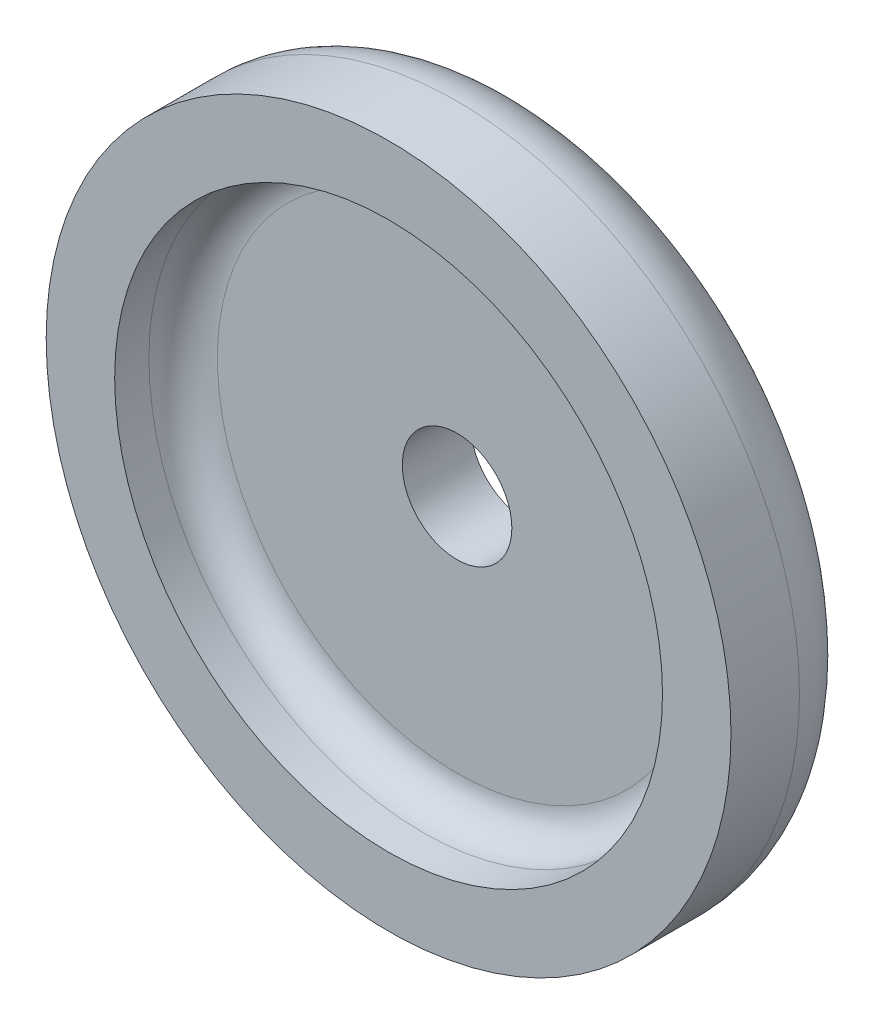
ISO-10303-21;
HEADER;
FILE_DESCRIPTION(('STEP AP214'),'2;1');
FILE_NAME('part.step','',(''),(''),'','','');
FILE_SCHEMA(('AUTOMOTIVE_DESIGN { 1 0 10303 214 1 1 1 1 }'));
ENDSEC;
DATA;
#1=APPLICATION_CONTEXT('core data for automotive mechanical design processes');
#2=APPLICATION_PROTOCOL_DEFINITION('international standard','automotive_design',2000,#1);
#3=PRODUCT_CONTEXT('',#1,'mechanical');
#4=PRODUCT('Part','Part','',(#3));
#5=PRODUCT_RELATED_PRODUCT_CATEGORY('part','',(#4));
#6=PRODUCT_DEFINITION_FORMATION('','',#4);
#7=PRODUCT_DEFINITION_CONTEXT('part definition',#1,'design');
#8=PRODUCT_DEFINITION('design','',#6,#7);
#9=PRODUCT_DEFINITION_SHAPE('','',#8);
#10=(LENGTH_UNIT() NAMED_UNIT(*) SI_UNIT(.MILLI.,.METRE.));
#11=(NAMED_UNIT(*) PLANE_ANGLE_UNIT() SI_UNIT($,.RADIAN.));
#12=(NAMED_UNIT(*) SI_UNIT($,.STERADIAN.) SOLID_ANGLE_UNIT());
#13=UNCERTAINTY_MEASURE_WITH_UNIT(LENGTH_MEASURE(1.E-05),#10,'distance_accuracy_value','');
#14=(GEOMETRIC_REPRESENTATION_CONTEXT(3) GLOBAL_UNCERTAINTY_ASSIGNED_CONTEXT((#13)) GLOBAL_UNIT_ASSIGNED_CONTEXT((#10,
#11,#12)) REPRESENTATION_CONTEXT('',''));
#15=CARTESIAN_POINT('',(0.,0.,0.));
#16=DIRECTION('',(0.,0.,1.));
#17=DIRECTION('',(1.,0.,0.));
#18=AXIS2_PLACEMENT_3D('',#15,#16,#17);
#19=CARTESIAN_POINT('',(0.,0.,2.));
#20=DIRECTION('',(0.,0.,-1.));
#21=DIRECTION('',(-1.,0.,0.));
#22=AXIS2_PLACEMENT_3D('',#19,#20,#21);
#23=CYLINDRICAL_SURFACE('',#22,5.);
#24=CARTESIAN_POINT('',(0.,0.,1.));
#25=DIRECTION('',(0.,0.,1.));
#26=DIRECTION('',(1.,0.,0.));
#27=AXIS2_PLACEMENT_3D('',#24,#25,#26);
#28=CIRCLE('',#27,5.);
#29=CARTESIAN_POINT('',(5.,0.,1.));
#30=VERTEX_POINT('',#29);
#31=EDGE_CURVE('E49',#30,#30,#28,.T.);
#32=ORIENTED_EDGE('',*,*,#31,.T.);
#33=EDGE_LOOP('',(#32));
#34=FACE_BOUND('',#33,.T.);
#35=CARTESIAN_POINT('',(0.,0.,2.));
#36=DIRECTION('',(0.,0.,1.));
#37=DIRECTION('',(1.,0.,0.));
#38=AXIS2_PLACEMENT_3D('',#35,#36,#37);
#39=CIRCLE('',#38,5.);
#40=CARTESIAN_POINT('',(5.,0.,2.));
#41=VERTEX_POINT('',#40);
#42=EDGE_CURVE('E61',#41,#41,#39,.T.);
#43=ORIENTED_EDGE('',*,*,#42,.F.);
#44=EDGE_LOOP('',(#43));
#45=FACE_BOUND('',#44,.T.);
#46=ADVANCED_FACE('F41',(#34,#45),#23,.T.);
#47=CARTESIAN_POINT('',(0.,0.,2.));
#48=DIRECTION('',(0.,0.,1.));
#49=DIRECTION('',(1.,0.,0.));
#50=AXIS2_PLACEMENT_3D('',#47,#48,#49);
#51=PLANE('',#50);
#52=CARTESIAN_POINT('',(0.,0.,2.));
#53=DIRECTION('',(0.,0.,1.));
#54=DIRECTION('',(1.,0.,0.));
#55=AXIS2_PLACEMENT_3D('',#52,#53,#54);
#56=CIRCLE('',#55,4.);
#57=CARTESIAN_POINT('',(4.,0.,2.));
#58=VERTEX_POINT('',#57);
#59=EDGE_CURVE('E64',#58,#58,#56,.T.);
#60=ORIENTED_EDGE('',*,*,#59,.F.);
#61=EDGE_LOOP('',(#60));
#62=FACE_BOUND('',#61,.T.);
#63=ORIENTED_EDGE('',*,*,#42,.T.);
#64=EDGE_LOOP('',(#63));
#65=FACE_BOUND('',#64,.T.);
#66=ADVANCED_FACE('F87',(#62,#65),#51,.T.);
#67=CARTESIAN_POINT('',(0.,0.,0.));
#68=DIRECTION('',(0.,0.,1.));
#69=DIRECTION('',(1.,0.,0.));
#70=AXIS2_PLACEMENT_3D('',#67,#68,#69);
#71=PLANE('',#70);
#72=CARTESIAN_POINT('',(0.,0.,0.));
#73=DIRECTION('',(0.,0.,1.));
#74=DIRECTION('',(1.,0.,0.));
#75=AXIS2_PLACEMENT_3D('',#72,#73,#74);
#76=CIRCLE('',#75,0.799999999999997);
#77=CARTESIAN_POINT('',(0.799999999999997,0.,0.));
#78=VERTEX_POINT('',#77);
#79=EDGE_CURVE('E45',#78,#78,#76,.T.);
#80=ORIENTED_EDGE('',*,*,#79,.T.);
#81=EDGE_LOOP('',(#80));
#82=FACE_BOUND('',#81,.T.);
#83=CARTESIAN_POINT('',(0.,0.,0.));
#84=DIRECTION('',(0.,0.,1.));
#85=DIRECTION('',(1.,0.,0.));
#86=AXIS2_PLACEMENT_3D('',#83,#84,#85);
#87=CIRCLE('',#86,4.);
#88=CARTESIAN_POINT('',(4.,0.,0.));
#89=VERTEX_POINT('',#88);
#90=EDGE_CURVE('E10',#89,#89,#87,.F.);
#91=ORIENTED_EDGE('',*,*,#90,.T.);
#92=EDGE_LOOP('',(#91));
#93=FACE_BOUND('',#92,.T.);
#94=ADVANCED_FACE('F74',(#82,#93),#71,.F.);
#95=CARTESIAN_POINT('',(0.,0.,2.));
#96=DIRECTION('',(0.,0.,-1.));
#97=DIRECTION('',(-1.,0.,0.));
#98=AXIS2_PLACEMENT_3D('',#95,#96,#97);
#99=CYLINDRICAL_SURFACE('',#98,4.);
#100=CARTESIAN_POINT('',(0.,0.,1.5));
#101=DIRECTION('',(0.,0.,1.));
#102=DIRECTION('',(1.,0.,0.));
#103=AXIS2_PLACEMENT_3D('',#100,#101,#102);
#104=CIRCLE('',#103,4.);
#105=CARTESIAN_POINT('',(4.,0.,1.5));
#106=VERTEX_POINT('',#105);
#107=EDGE_CURVE('E53',#106,#106,#104,.F.);
#108=ORIENTED_EDGE('',*,*,#107,.T.);
#109=EDGE_LOOP('',(#108));
#110=FACE_BOUND('',#109,.T.);
#111=ORIENTED_EDGE('',*,*,#59,.T.);
#112=EDGE_LOOP('',(#111));
#113=FACE_BOUND('',#112,.T.);
#114=ADVANCED_FACE('F104',(#110,#113),#99,.F.);
#115=CARTESIAN_POINT('',(0.,0.,1.));
#116=DIRECTION('',(0.,0.,1.));
#117=DIRECTION('',(1.,0.,0.));
#118=AXIS2_PLACEMENT_3D('',#115,#116,#117);
#119=PLANE('',#118);
#120=CARTESIAN_POINT('',(0.,0.,1.));
#121=DIRECTION('',(0.,0.,1.));
#122=DIRECTION('',(1.,0.,0.));
#123=AXIS2_PLACEMENT_3D('',#120,#121,#122);
#124=CIRCLE('',#123,0.799999999999998);
#125=CARTESIAN_POINT('',(0.799999999999998,0.,1.));
#126=VERTEX_POINT('',#125);
#127=EDGE_CURVE('E67',#126,#126,#124,.T.);
#128=ORIENTED_EDGE('',*,*,#127,.F.);
#129=EDGE_LOOP('',(#128));
#130=FACE_BOUND('',#129,.T.);
#131=CARTESIAN_POINT('',(0.,0.,1.));
#132=DIRECTION('',(0.,0.,1.));
#133=DIRECTION('',(1.,0.,0.));
#134=AXIS2_PLACEMENT_3D('',#131,#132,#133);
#135=CIRCLE('',#134,3.5);
#136=CARTESIAN_POINT('',(3.5,0.,1.));
#137=VERTEX_POINT('',#136);
#138=EDGE_CURVE('E58',#137,#137,#135,.T.);
#139=ORIENTED_EDGE('',*,*,#138,.T.);
#140=EDGE_LOOP('',(#139));
#141=FACE_BOUND('',#140,.T.);
#142=ADVANCED_FACE('F98',(#130,#141),#119,.T.);
#143=CARTESIAN_POINT('',(0.,0.,1.5));
#144=DIRECTION('',(0.,0.,1.));
#145=DIRECTION('',(1.,0.,0.));
#146=AXIS2_PLACEMENT_3D('',#143,#144,#145);
#147=TOROIDAL_SURFACE('',#146,3.5,0.5);
#148=ORIENTED_EDGE('',*,*,#107,.F.);
#149=EDGE_LOOP('',(#148));
#150=FACE_BOUND('',#149,.T.);
#151=ORIENTED_EDGE('',*,*,#138,.F.);
#152=EDGE_LOOP('',(#151));
#153=FACE_BOUND('',#152,.T.);
#154=ADVANCED_FACE('F83',(#150,#153),#147,.F.);
#155=CARTESIAN_POINT('',(0.,0.,1.));
#156=DIRECTION('',(0.,0.,1.));
#157=DIRECTION('',(1.,0.,0.));
#158=AXIS2_PLACEMENT_3D('',#155,#156,#157);
#159=TOROIDAL_SURFACE('',#158,4.,1.);
#160=ORIENTED_EDGE('',*,*,#90,.F.);
#161=EDGE_LOOP('',(#160));
#162=FACE_BOUND('',#161,.T.);
#163=ORIENTED_EDGE('',*,*,#31,.F.);
#164=EDGE_LOOP('',(#163));
#165=FACE_BOUND('',#164,.T.);
#166=ADVANCED_FACE('F43',(#162,#165),#159,.T.);
#167=CARTESIAN_POINT('',(0.,0.,1.));
#168=DIRECTION('',(0.,0.,1.));
#169=DIRECTION('',(1.,0.,0.));
#170=AXIS2_PLACEMENT_3D('',#167,#168,#169);
#171=CYLINDRICAL_SURFACE('',#170,0.799999999999997);
#172=ORIENTED_EDGE('',*,*,#127,.T.);
#173=EDGE_LOOP('',(#172));
#174=FACE_BOUND('',#173,.T.);
#175=ORIENTED_EDGE('',*,*,#79,.F.);
#176=EDGE_LOOP('',(#175));
#177=FACE_BOUND('',#176,.T.);
#178=ADVANCED_FACE('F76',(#174,#177),#171,.F.);
#179=CLOSED_SHELL('',(#46,#66,#94,#114,#142,#154,#166,#178));
#180=MANIFOLD_SOLID_BREP('B2',#179);
#181=ADVANCED_BREP_SHAPE_REPRESENTATION('',(#18,#180),#14);
#182=SHAPE_DEFINITION_REPRESENTATION(#9,#181);
ENDSEC;
END-ISO-10303-21;
